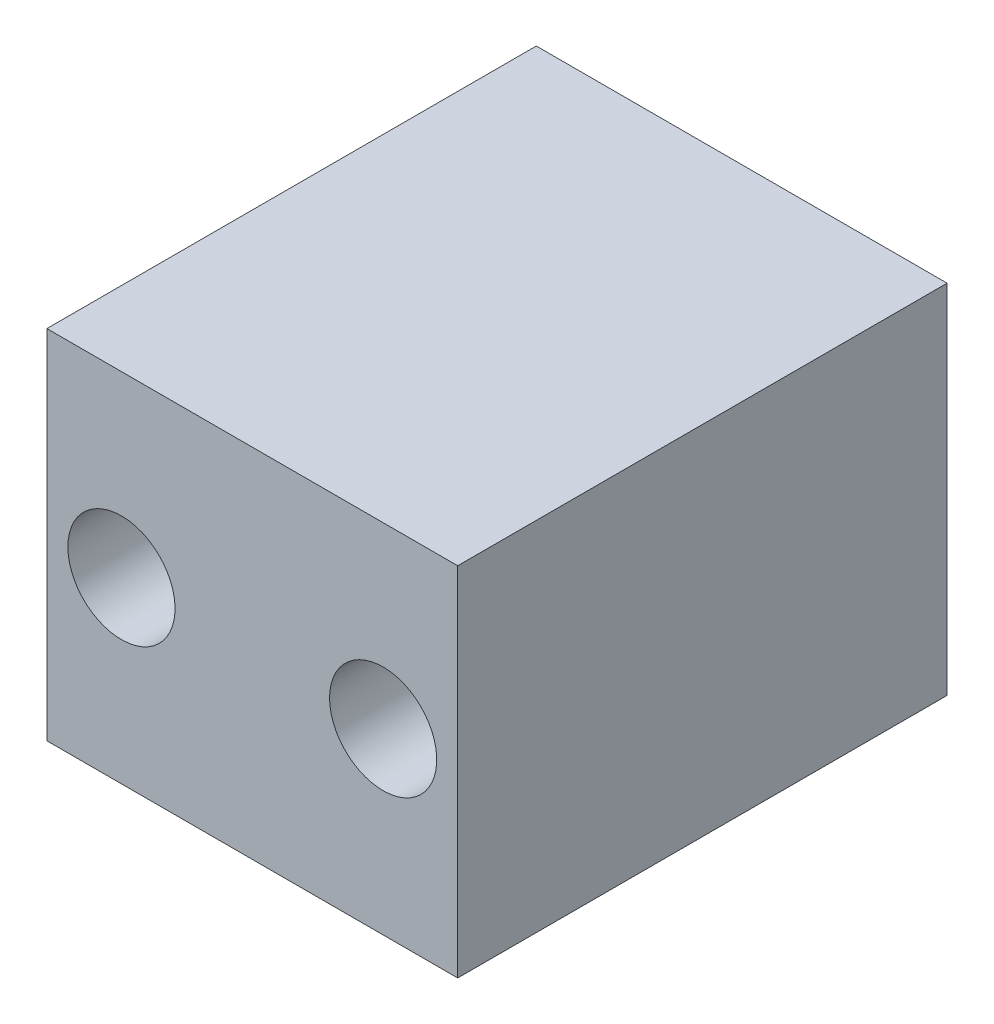
ISO-10303-21;
HEADER;
FILE_DESCRIPTION(('STEP AP214'),'2;1');
FILE_NAME('part.step','',(''),(''),'','','');
FILE_SCHEMA(('AUTOMOTIVE_DESIGN { 1 0 10303 214 1 1 1 1 }'));
ENDSEC;
DATA;
#1=APPLICATION_CONTEXT('core data for automotive mechanical design processes');
#2=APPLICATION_PROTOCOL_DEFINITION('international standard','automotive_design',2000,#1);
#3=PRODUCT_CONTEXT('',#1,'mechanical');
#4=PRODUCT('Part','Part','',(#3));
#5=PRODUCT_RELATED_PRODUCT_CATEGORY('part','',(#4));
#6=PRODUCT_DEFINITION_FORMATION('','',#4);
#7=PRODUCT_DEFINITION_CONTEXT('part definition',#1,'design');
#8=PRODUCT_DEFINITION('design','',#6,#7);
#9=PRODUCT_DEFINITION_SHAPE('','',#8);
#10=(LENGTH_UNIT() NAMED_UNIT(*) SI_UNIT(.MILLI.,.METRE.));
#11=(NAMED_UNIT(*) PLANE_ANGLE_UNIT() SI_UNIT($,.RADIAN.));
#12=(NAMED_UNIT(*) SI_UNIT($,.STERADIAN.) SOLID_ANGLE_UNIT());
#13=UNCERTAINTY_MEASURE_WITH_UNIT(LENGTH_MEASURE(1.E-05),#10,'distance_accuracy_value','');
#14=(GEOMETRIC_REPRESENTATION_CONTEXT(3) GLOBAL_UNCERTAINTY_ASSIGNED_CONTEXT((#13)) GLOBAL_UNIT_ASSIGNED_CONTEXT((#10,
#11,#12)) REPRESENTATION_CONTEXT('',''));
#15=CARTESIAN_POINT('',(0.,0.,0.));
#16=DIRECTION('',(0.,0.,1.));
#17=DIRECTION('',(1.,0.,0.));
#18=AXIS2_PLACEMENT_3D('',#15,#16,#17);
#19=CARTESIAN_POINT('',(0.,0.,13.7));
#20=DIRECTION('',(0.,0.,1.));
#21=DIRECTION('',(1.,0.,0.));
#22=AXIS2_PLACEMENT_3D('',#19,#20,#21);
#23=PLANE('',#22);
#24=CARTESIAN_POINT('',(3.66251499734136,0.,13.7));
#25=DIRECTION('',(0.,0.,1.));
#26=DIRECTION('',(1.,0.,0.));
#27=AXIS2_PLACEMENT_3D('',#24,#25,#26);
#28=CIRCLE('',#27,1.5);
#29=CARTESIAN_POINT('',(2.16251499734136,0.,13.7));
#30=VERTEX_POINT('',#29);
#31=EDGE_CURVE('E99',#30,#30,#28,.T.);
#32=ORIENTED_EDGE('',*,*,#31,.F.);
#33=EDGE_LOOP('',(#32));
#34=FACE_BOUND('',#33,.T.);
#35=DIRECTION('',(0.,1.,0.));
#36=VECTOR('',#35,1.);
#37=CARTESIAN_POINT('',(5.75,4.99715505292014,13.7));
#38=LINE('',#37,#36);
#39=CARTESIAN_POINT('',(5.75,-4.99715505292014,13.7));
#40=VERTEX_POINT('',#39);
#41=CARTESIAN_POINT('',(5.75,4.99715505292014,13.7));
#42=VERTEX_POINT('',#41);
#43=EDGE_CURVE('E84',#40,#42,#38,.T.);
#44=ORIENTED_EDGE('',*,*,#43,.T.);
#45=DIRECTION('',(-1.,0.,0.));
#46=VECTOR('',#45,1.);
#47=CARTESIAN_POINT('',(-5.75,4.99715505292014,13.7));
#48=LINE('',#47,#46);
#49=CARTESIAN_POINT('',(-5.75,4.99715505292014,13.7));
#50=VERTEX_POINT('',#49);
#51=EDGE_CURVE('E79',#42,#50,#48,.T.);
#52=ORIENTED_EDGE('',*,*,#51,.T.);
#53=DIRECTION('',(0.,-1.,0.));
#54=VECTOR('',#53,1.);
#55=CARTESIAN_POINT('',(-5.75,4.99715505292014,13.7));
#56=LINE('',#55,#54);
#57=CARTESIAN_POINT('',(-5.74999999999999,-4.99715505292014,13.7));
#58=VERTEX_POINT('',#57);
#59=EDGE_CURVE('E82',#50,#58,#56,.T.);
#60=ORIENTED_EDGE('',*,*,#59,.T.);
#61=DIRECTION('',(1.,0.,0.));
#62=VECTOR('',#61,1.);
#63=CARTESIAN_POINT('',(-5.74999999999999,-4.99715505292014,13.7));
#64=LINE('',#63,#62);
#65=EDGE_CURVE('E49',#58,#40,#64,.T.);
#66=ORIENTED_EDGE('',*,*,#65,.T.);
#67=EDGE_LOOP('',(#44,#52,#60,#66));
#68=FACE_BOUND('',#67,.T.);
#69=CARTESIAN_POINT('',(-3.66251499734287,0.,13.7));
#70=DIRECTION('',(0.,0.,1.));
#71=DIRECTION('',(1.,0.,0.));
#72=AXIS2_PLACEMENT_3D('',#69,#70,#71);
#73=CIRCLE('',#72,1.5);
#74=CARTESIAN_POINT('',(-5.16251499734287,0.,13.7));
#75=VERTEX_POINT('',#74);
#76=EDGE_CURVE('E114',#75,#75,#73,.T.);
#77=ORIENTED_EDGE('',*,*,#76,.F.);
#78=EDGE_LOOP('',(#77));
#79=FACE_BOUND('',#78,.T.);
#80=ADVANCED_FACE('F32',(#34,#68,#79),#23,.T.);
#81=CARTESIAN_POINT('',(0.,0.,0.));
#82=DIRECTION('',(0.,0.,1.));
#83=DIRECTION('',(1.,0.,0.));
#84=AXIS2_PLACEMENT_3D('',#81,#82,#83);
#85=PLANE('',#84);
#86=DIRECTION('',(0.,1.,0.));
#87=VECTOR('',#86,1.);
#88=CARTESIAN_POINT('',(5.75,4.99715505292014,0.));
#89=LINE('',#88,#87);
#90=CARTESIAN_POINT('',(5.75,-4.99715505292014,0.));
#91=VERTEX_POINT('',#90);
#92=CARTESIAN_POINT('',(5.75,4.99715505292014,0.));
#93=VERTEX_POINT('',#92);
#94=EDGE_CURVE('E96',#91,#93,#89,.T.);
#95=ORIENTED_EDGE('',*,*,#94,.F.);
#96=DIRECTION('',(1.,0.,0.));
#97=VECTOR('',#96,1.);
#98=CARTESIAN_POINT('',(-5.74999999999999,-4.99715505292014,0.));
#99=LINE('',#98,#97);
#100=CARTESIAN_POINT('',(-5.74999999999999,-4.99715505292014,0.));
#101=VERTEX_POINT('',#100);
#102=EDGE_CURVE('E72',#101,#91,#99,.T.);
#103=ORIENTED_EDGE('',*,*,#102,.F.);
#104=DIRECTION('',(0.,-1.,0.));
#105=VECTOR('',#104,1.);
#106=CARTESIAN_POINT('',(-5.75,4.99715505292014,0.));
#107=LINE('',#106,#105);
#108=CARTESIAN_POINT('',(-5.75,4.99715505292014,0.));
#109=VERTEX_POINT('',#108);
#110=EDGE_CURVE('E66',#109,#101,#107,.T.);
#111=ORIENTED_EDGE('',*,*,#110,.F.);
#112=DIRECTION('',(-1.,0.,0.));
#113=VECTOR('',#112,1.);
#114=CARTESIAN_POINT('',(-5.75,4.99715505292014,0.));
#115=LINE('',#114,#113);
#116=EDGE_CURVE('E88',#93,#109,#115,.T.);
#117=ORIENTED_EDGE('',*,*,#116,.F.);
#118=EDGE_LOOP('',(#95,#103,#111,#117));
#119=FACE_BOUND('',#118,.T.);
#120=CARTESIAN_POINT('',(3.66251499734136,0.,0.));
#121=DIRECTION('',(0.,0.,1.));
#122=DIRECTION('',(1.,0.,0.));
#123=AXIS2_PLACEMENT_3D('',#120,#121,#122);
#124=CIRCLE('',#123,1.5);
#125=CARTESIAN_POINT('',(2.16251499734136,0.,0.));
#126=VERTEX_POINT('',#125);
#127=EDGE_CURVE('E111',#126,#126,#124,.T.);
#128=ORIENTED_EDGE('',*,*,#127,.T.);
#129=EDGE_LOOP('',(#128));
#130=FACE_BOUND('',#129,.T.);
#131=CARTESIAN_POINT('',(-3.66251499734287,0.,0.));
#132=DIRECTION('',(0.,0.,1.));
#133=DIRECTION('',(1.,0.,0.));
#134=AXIS2_PLACEMENT_3D('',#131,#132,#133);
#135=CIRCLE('',#134,1.5);
#136=CARTESIAN_POINT('',(-5.16251499734287,0.,0.));
#137=VERTEX_POINT('',#136);
#138=EDGE_CURVE('E117',#137,#137,#135,.T.);
#139=ORIENTED_EDGE('',*,*,#138,.T.);
#140=EDGE_LOOP('',(#139));
#141=FACE_BOUND('',#140,.T.);
#142=ADVANCED_FACE('F107',(#119,#130,#141),#85,.F.);
#143=CARTESIAN_POINT('',(5.75,4.99715505292014,13.7));
#144=DIRECTION('',(-1.,0.,0.));
#145=DIRECTION('',(0.,0.,1.));
#146=AXIS2_PLACEMENT_3D('',#143,#144,#145);
#147=PLANE('',#146);
#148=ORIENTED_EDGE('',*,*,#94,.T.);
#149=DIRECTION('',(0.,0.,-1.));
#150=VECTOR('',#149,1.);
#151=CARTESIAN_POINT('',(5.75,4.99715505292014,13.7));
#152=LINE('',#151,#150);
#153=EDGE_CURVE('E11',#42,#93,#152,.T.);
#154=ORIENTED_EDGE('',*,*,#153,.F.);
#155=ORIENTED_EDGE('',*,*,#43,.F.);
#156=DIRECTION('',(0.,0.,-1.));
#157=VECTOR('',#156,1.);
#158=CARTESIAN_POINT('',(5.75,-4.99715505292014,13.7));
#159=LINE('',#158,#157);
#160=EDGE_CURVE('E92',#40,#91,#159,.T.);
#161=ORIENTED_EDGE('',*,*,#160,.T.);
#162=EDGE_LOOP('',(#148,#154,#155,#161));
#163=FACE_BOUND('',#162,.T.);
#164=ADVANCED_FACE('F34',(#163),#147,.F.);
#165=CARTESIAN_POINT('',(-5.75,4.99715505292014,13.7));
#166=DIRECTION('',(0.,-1.,0.));
#167=DIRECTION('',(0.,0.,-1.));
#168=AXIS2_PLACEMENT_3D('',#165,#166,#167);
#169=PLANE('',#168);
#170=ORIENTED_EDGE('',*,*,#116,.T.);
#171=DIRECTION('',(0.,0.,-1.));
#172=VECTOR('',#171,1.);
#173=CARTESIAN_POINT('',(-5.75,4.99715505292014,13.7));
#174=LINE('',#173,#172);
#175=EDGE_CURVE('E41',#50,#109,#174,.T.);
#176=ORIENTED_EDGE('',*,*,#175,.F.);
#177=ORIENTED_EDGE('',*,*,#51,.F.);
#178=ORIENTED_EDGE('',*,*,#153,.T.);
#179=EDGE_LOOP('',(#170,#176,#177,#178));
#180=FACE_BOUND('',#179,.T.);
#181=ADVANCED_FACE('F87',(#180),#169,.F.);
#182=CARTESIAN_POINT('',(-5.75,4.99715505292014,13.7));
#183=DIRECTION('',(1.,0.,0.));
#184=DIRECTION('',(0.,1.,0.));
#185=AXIS2_PLACEMENT_3D('',#182,#183,#184);
#186=PLANE('',#185);
#187=ORIENTED_EDGE('',*,*,#110,.T.);
#188=DIRECTION('',(0.,0.,-1.));
#189=VECTOR('',#188,1.);
#190=CARTESIAN_POINT('',(-5.74999999999999,-4.99715505292014,13.7));
#191=LINE('',#190,#189);
#192=EDGE_CURVE('E89',#58,#101,#191,.T.);
#193=ORIENTED_EDGE('',*,*,#192,.F.);
#194=ORIENTED_EDGE('',*,*,#59,.F.);
#195=ORIENTED_EDGE('',*,*,#175,.T.);
#196=EDGE_LOOP('',(#187,#193,#194,#195));
#197=FACE_BOUND('',#196,.T.);
#198=ADVANCED_FACE('F90',(#197),#186,.F.);
#199=CARTESIAN_POINT('',(-5.74999999999999,-4.99715505292014,13.7));
#200=DIRECTION('',(0.,1.,0.));
#201=DIRECTION('',(0.,0.,1.));
#202=AXIS2_PLACEMENT_3D('',#199,#200,#201);
#203=PLANE('',#202);
#204=ORIENTED_EDGE('',*,*,#102,.T.);
#205=ORIENTED_EDGE('',*,*,#160,.F.);
#206=ORIENTED_EDGE('',*,*,#65,.F.);
#207=ORIENTED_EDGE('',*,*,#192,.T.);
#208=EDGE_LOOP('',(#204,#205,#206,#207));
#209=FACE_BOUND('',#208,.T.);
#210=ADVANCED_FACE('F104',(#209),#203,.F.);
#211=CARTESIAN_POINT('',(3.66251499734136,0.,13.7));
#212=DIRECTION('',(0.,0.,-1.));
#213=DIRECTION('',(-1.,0.,0.));
#214=AXIS2_PLACEMENT_3D('',#211,#212,#213);
#215=CYLINDRICAL_SURFACE('',#214,1.5);
#216=CARTESIAN_POINT('',(2.16251499734136,0.,13.7));
#217=CARTESIAN_POINT('',(2.16251499734136,0.,13.5572916666667));
#218=CARTESIAN_POINT('',(2.16251499734136,0.,13.4145833333333));
#219=CARTESIAN_POINT('',(2.16251499734136,0.,13.1291666666667));
#220=CARTESIAN_POINT('',(2.16251499734136,0.,12.9864583333333));
#221=CARTESIAN_POINT('',(2.16251499734136,0.,12.7010416666667));
#222=CARTESIAN_POINT('',(2.16251499734136,0.,12.5583333333333));
#223=CARTESIAN_POINT('',(2.16251499734136,0.,12.2729166666667));
#224=CARTESIAN_POINT('',(2.16251499734136,0.,12.1302083333333));
#225=CARTESIAN_POINT('',(2.16251499734136,0.,11.8447916666667));
#226=CARTESIAN_POINT('',(2.16251499734136,0.,11.7020833333333));
#227=CARTESIAN_POINT('',(2.16251499734136,0.,11.4166666666667));
#228=CARTESIAN_POINT('',(2.16251499734136,0.,11.2739583333333));
#229=CARTESIAN_POINT('',(2.16251499734136,0.,10.9885416666667));
#230=CARTESIAN_POINT('',(2.16251499734136,0.,10.8458333333333));
#231=CARTESIAN_POINT('',(2.16251499734136,0.,10.5604166666667));
#232=CARTESIAN_POINT('',(2.16251499734136,0.,10.4177083333333));
#233=CARTESIAN_POINT('',(2.16251499734136,0.,10.1322916666667));
#234=CARTESIAN_POINT('',(2.16251499734136,0.,9.98958333333333));
#235=CARTESIAN_POINT('',(2.16251499734136,0.,9.70416666666666));
#236=CARTESIAN_POINT('',(2.16251499734136,0.,9.56145833333333));
#237=CARTESIAN_POINT('',(2.16251499734136,0.,9.27604166666666));
#238=CARTESIAN_POINT('',(2.16251499734136,0.,9.13333333333333));
#239=CARTESIAN_POINT('',(2.16251499734136,0.,8.84791666666666));
#240=CARTESIAN_POINT('',(2.16251499734136,0.,8.70520833333333));
#241=CARTESIAN_POINT('',(2.16251499734136,0.,8.41979166666667));
#242=CARTESIAN_POINT('',(2.16251499734136,0.,8.27708333333333));
#243=CARTESIAN_POINT('',(2.16251499734136,0.,7.99166666666667));
#244=CARTESIAN_POINT('',(2.16251499734136,0.,7.84895833333333));
#245=CARTESIAN_POINT('',(2.16251499734136,0.,7.56354166666667));
#246=CARTESIAN_POINT('',(2.16251499734136,0.,7.42083333333333));
#247=CARTESIAN_POINT('',(2.16251499734136,0.,7.13541666666667));
#248=CARTESIAN_POINT('',(2.16251499734136,0.,6.99270833333333));
#249=CARTESIAN_POINT('',(2.16251499734136,0.,6.70729166666667));
#250=CARTESIAN_POINT('',(2.16251499734136,0.,6.56458333333333));
#251=CARTESIAN_POINT('',(2.16251499734136,0.,6.27916666666667));
#252=CARTESIAN_POINT('',(2.16251499734136,0.,6.13645833333333));
#253=CARTESIAN_POINT('',(2.16251499734136,0.,5.85104166666667));
#254=CARTESIAN_POINT('',(2.16251499734136,0.,5.70833333333333));
#255=CARTESIAN_POINT('',(2.16251499734136,0.,5.42291666666667));
#256=CARTESIAN_POINT('',(2.16251499734136,0.,5.28020833333333));
#257=CARTESIAN_POINT('',(2.16251499734136,0.,4.99479166666667));
#258=CARTESIAN_POINT('',(2.16251499734136,0.,4.85208333333333));
#259=CARTESIAN_POINT('',(2.16251499734136,0.,4.56666666666667));
#260=CARTESIAN_POINT('',(2.16251499734136,0.,4.42395833333333));
#261=CARTESIAN_POINT('',(2.16251499734136,0.,4.13854166666667));
#262=CARTESIAN_POINT('',(2.16251499734136,0.,3.99583333333333));
#263=CARTESIAN_POINT('',(2.16251499734136,0.,3.71041666666667));
#264=CARTESIAN_POINT('',(2.16251499734136,0.,3.56770833333333));
#265=CARTESIAN_POINT('',(2.16251499734136,0.,3.28229166666667));
#266=CARTESIAN_POINT('',(2.16251499734136,0.,3.13958333333333));
#267=CARTESIAN_POINT('',(2.16251499734136,0.,2.85416666666667));
#268=CARTESIAN_POINT('',(2.16251499734136,0.,2.71145833333333));
#269=CARTESIAN_POINT('',(2.16251499734136,0.,2.42604166666667));
#270=CARTESIAN_POINT('',(2.16251499734136,0.,2.28333333333333));
#271=CARTESIAN_POINT('',(2.16251499734136,0.,1.99791666666667));
#272=CARTESIAN_POINT('',(2.16251499734136,0.,1.85520833333333));
#273=CARTESIAN_POINT('',(2.16251499734136,0.,1.56979166666667));
#274=CARTESIAN_POINT('',(2.16251499734136,0.,1.42708333333333));
#275=CARTESIAN_POINT('',(2.16251499734136,0.,1.14166666666667));
#276=CARTESIAN_POINT('',(2.16251499734136,0.,0.998958333333333));
#277=CARTESIAN_POINT('',(2.16251499734136,0.,0.713541666666666));
#278=CARTESIAN_POINT('',(2.16251499734136,0.,0.570833333333333));
#279=CARTESIAN_POINT('',(2.16251499734136,0.,0.285416666666666));
#280=CARTESIAN_POINT('',(2.16251499734136,0.,0.142708333333333));
#281=CARTESIAN_POINT('',(2.16251499734136,0.,0.));
#282=B_SPLINE_CURVE_WITH_KNOTS('',3,(#216,#217,#218,#219,#220,#221,#222,#223,#224,#225,#226,
#227,#228,#229,#230,#231,#232,#233,#234,#235,#236,#237,#238,#239,#240,#241,#242,#243,#244,#245,
#246,#247,#248,#249,#250,#251,#252,#253,#254,#255,#256,#257,#258,#259,#260,#261,#262,#263,#264,
#265,#266,#267,#268,#269,#270,#271,#272,#273,#274,#275,#276,#277,#278,#279,#280,#281),
.UNSPECIFIED.,.F.,.F.,(4,2,2,2,2,2,2,2,2,2,2,2,2,2,2,2,2,2,2,2,2,2,2,2,2,2,2,2,2,2,2,2,4),(0.,
0.428125000000001,0.856250000000001,1.284375,1.7125,2.140625,2.56875,2.996875,3.425,3.853125,
4.28125,4.709375,5.1375,5.565625,5.99375,6.421875,6.85,7.278125,7.70625,8.134375,8.5625,
8.990625,9.41875,9.846875,10.275,10.703125,11.13125,11.559375,11.9875,12.415625,12.84375,
13.271875,13.7),.UNSPECIFIED.);
#283=EDGE_CURVE('BSEAM134',#30,#126,#282,.T.);
#284=ORIENTED_EDGE('',*,*,#31,.T.);
#285=ORIENTED_EDGE('',*,*,#127,.F.);
#286=ORIENTED_EDGE('',*,*,#283,.T.);
#287=ORIENTED_EDGE('',*,*,#283,.F.);
#288=EDGE_LOOP('',(#284,#286,#285,#287));
#289=FACE_BOUND('',#288,.T.);
#290=ADVANCED_FACE('F134',(#289),#215,.F.);
#291=CARTESIAN_POINT('',(-3.66251499734287,0.,13.7));
#292=DIRECTION('',(0.,0.,-1.));
#293=DIRECTION('',(-1.,0.,0.));
#294=AXIS2_PLACEMENT_3D('',#291,#292,#293);
#295=CYLINDRICAL_SURFACE('',#294,1.5);
#296=CARTESIAN_POINT('',(-5.16251499734287,0.,13.7));
#297=CARTESIAN_POINT('',(-5.16251499734287,0.,13.5572916666667));
#298=CARTESIAN_POINT('',(-5.16251499734287,0.,13.4145833333333));
#299=CARTESIAN_POINT('',(-5.16251499734287,0.,13.1291666666667));
#300=CARTESIAN_POINT('',(-5.16251499734287,0.,12.9864583333333));
#301=CARTESIAN_POINT('',(-5.16251499734287,0.,12.7010416666667));
#302=CARTESIAN_POINT('',(-5.16251499734287,0.,12.5583333333333));
#303=CARTESIAN_POINT('',(-5.16251499734287,0.,12.2729166666667));
#304=CARTESIAN_POINT('',(-5.16251499734287,0.,12.1302083333333));
#305=CARTESIAN_POINT('',(-5.16251499734287,0.,11.8447916666667));
#306=CARTESIAN_POINT('',(-5.16251499734287,0.,11.7020833333333));
#307=CARTESIAN_POINT('',(-5.16251499734287,0.,11.4166666666667));
#308=CARTESIAN_POINT('',(-5.16251499734287,0.,11.2739583333333));
#309=CARTESIAN_POINT('',(-5.16251499734287,0.,10.9885416666667));
#310=CARTESIAN_POINT('',(-5.16251499734287,0.,10.8458333333333));
#311=CARTESIAN_POINT('',(-5.16251499734287,0.,10.5604166666667));
#312=CARTESIAN_POINT('',(-5.16251499734287,0.,10.4177083333333));
#313=CARTESIAN_POINT('',(-5.16251499734287,0.,10.1322916666667));
#314=CARTESIAN_POINT('',(-5.16251499734287,0.,9.98958333333333));
#315=CARTESIAN_POINT('',(-5.16251499734287,0.,9.70416666666666));
#316=CARTESIAN_POINT('',(-5.16251499734287,0.,9.56145833333333));
#317=CARTESIAN_POINT('',(-5.16251499734287,0.,9.27604166666666));
#318=CARTESIAN_POINT('',(-5.16251499734287,0.,9.13333333333333));
#319=CARTESIAN_POINT('',(-5.16251499734287,0.,8.84791666666666));
#320=CARTESIAN_POINT('',(-5.16251499734287,0.,8.70520833333333));
#321=CARTESIAN_POINT('',(-5.16251499734287,0.,8.41979166666667));
#322=CARTESIAN_POINT('',(-5.16251499734287,0.,8.27708333333333));
#323=CARTESIAN_POINT('',(-5.16251499734287,0.,7.99166666666667));
#324=CARTESIAN_POINT('',(-5.16251499734287,0.,7.84895833333333));
#325=CARTESIAN_POINT('',(-5.16251499734287,0.,7.56354166666667));
#326=CARTESIAN_POINT('',(-5.16251499734287,0.,7.42083333333333));
#327=CARTESIAN_POINT('',(-5.16251499734287,0.,7.13541666666667));
#328=CARTESIAN_POINT('',(-5.16251499734287,0.,6.99270833333333));
#329=CARTESIAN_POINT('',(-5.16251499734287,0.,6.70729166666667));
#330=CARTESIAN_POINT('',(-5.16251499734287,0.,6.56458333333333));
#331=CARTESIAN_POINT('',(-5.16251499734287,0.,6.27916666666667));
#332=CARTESIAN_POINT('',(-5.16251499734287,0.,6.13645833333333));
#333=CARTESIAN_POINT('',(-5.16251499734287,0.,5.85104166666667));
#334=CARTESIAN_POINT('',(-5.16251499734287,0.,5.70833333333333));
#335=CARTESIAN_POINT('',(-5.16251499734287,0.,5.42291666666667));
#336=CARTESIAN_POINT('',(-5.16251499734287,0.,5.28020833333333));
#337=CARTESIAN_POINT('',(-5.16251499734287,0.,4.99479166666667));
#338=CARTESIAN_POINT('',(-5.16251499734287,0.,4.85208333333333));
#339=CARTESIAN_POINT('',(-5.16251499734287,0.,4.56666666666667));
#340=CARTESIAN_POINT('',(-5.16251499734287,0.,4.42395833333333));
#341=CARTESIAN_POINT('',(-5.16251499734287,0.,4.13854166666667));
#342=CARTESIAN_POINT('',(-5.16251499734287,0.,3.99583333333333));
#343=CARTESIAN_POINT('',(-5.16251499734287,0.,3.71041666666667));
#344=CARTESIAN_POINT('',(-5.16251499734287,0.,3.56770833333333));
#345=CARTESIAN_POINT('',(-5.16251499734287,0.,3.28229166666667));
#346=CARTESIAN_POINT('',(-5.16251499734287,0.,3.13958333333333));
#347=CARTESIAN_POINT('',(-5.16251499734287,0.,2.85416666666667));
#348=CARTESIAN_POINT('',(-5.16251499734287,0.,2.71145833333333));
#349=CARTESIAN_POINT('',(-5.16251499734287,0.,2.42604166666667));
#350=CARTESIAN_POINT('',(-5.16251499734287,0.,2.28333333333333));
#351=CARTESIAN_POINT('',(-5.16251499734287,0.,1.99791666666667));
#352=CARTESIAN_POINT('',(-5.16251499734287,0.,1.85520833333333));
#353=CARTESIAN_POINT('',(-5.16251499734287,0.,1.56979166666667));
#354=CARTESIAN_POINT('',(-5.16251499734287,0.,1.42708333333333));
#355=CARTESIAN_POINT('',(-5.16251499734287,0.,1.14166666666667));
#356=CARTESIAN_POINT('',(-5.16251499734287,0.,0.998958333333333));
#357=CARTESIAN_POINT('',(-5.16251499734287,0.,0.713541666666666));
#358=CARTESIAN_POINT('',(-5.16251499734287,0.,0.570833333333333));
#359=CARTESIAN_POINT('',(-5.16251499734287,0.,0.285416666666666));
#360=CARTESIAN_POINT('',(-5.16251499734287,0.,0.142708333333333));
#361=CARTESIAN_POINT('',(-5.16251499734287,0.,0.));
#362=B_SPLINE_CURVE_WITH_KNOTS('',3,(#296,#297,#298,#299,#300,#301,#302,#303,#304,#305,#306,
#307,#308,#309,#310,#311,#312,#313,#314,#315,#316,#317,#318,#319,#320,#321,#322,#323,#324,#325,
#326,#327,#328,#329,#330,#331,#332,#333,#334,#335,#336,#337,#338,#339,#340,#341,#342,#343,#344,
#345,#346,#347,#348,#349,#350,#351,#352,#353,#354,#355,#356,#357,#358,#359,#360,#361),
.UNSPECIFIED.,.F.,.F.,(4,2,2,2,2,2,2,2,2,2,2,2,2,2,2,2,2,2,2,2,2,2,2,2,2,2,2,2,2,2,2,2,4),(0.,
0.428125000000001,0.856250000000001,1.284375,1.7125,2.140625,2.56875,2.996875,3.425,3.853125,
4.28125,4.709375,5.1375,5.565625,5.99375,6.421875,6.85,7.278125,7.70625,8.134375,8.5625,
8.990625,9.41875,9.846875,10.275,10.703125,11.13125,11.559375,11.9875,12.415625,12.84375,
13.271875,13.7),.UNSPECIFIED.);
#363=EDGE_CURVE('BSEAM123',#75,#137,#362,.T.);
#364=ORIENTED_EDGE('',*,*,#76,.T.);
#365=ORIENTED_EDGE('',*,*,#138,.F.);
#366=ORIENTED_EDGE('',*,*,#363,.T.);
#367=ORIENTED_EDGE('',*,*,#363,.F.);
#368=EDGE_LOOP('',(#364,#366,#365,#367));
#369=FACE_BOUND('',#368,.T.);
#370=ADVANCED_FACE('F123',(#369),#295,.F.);
#371=CLOSED_SHELL('',(#80,#142,#164,#181,#198,#210,#290,#370));
#372=MANIFOLD_SOLID_BREP('B2',#371);
#373=ADVANCED_BREP_SHAPE_REPRESENTATION('',(#18,#372),#14);
#374=SHAPE_DEFINITION_REPRESENTATION(#9,#373);
ENDSEC;
END-ISO-10303-21;
